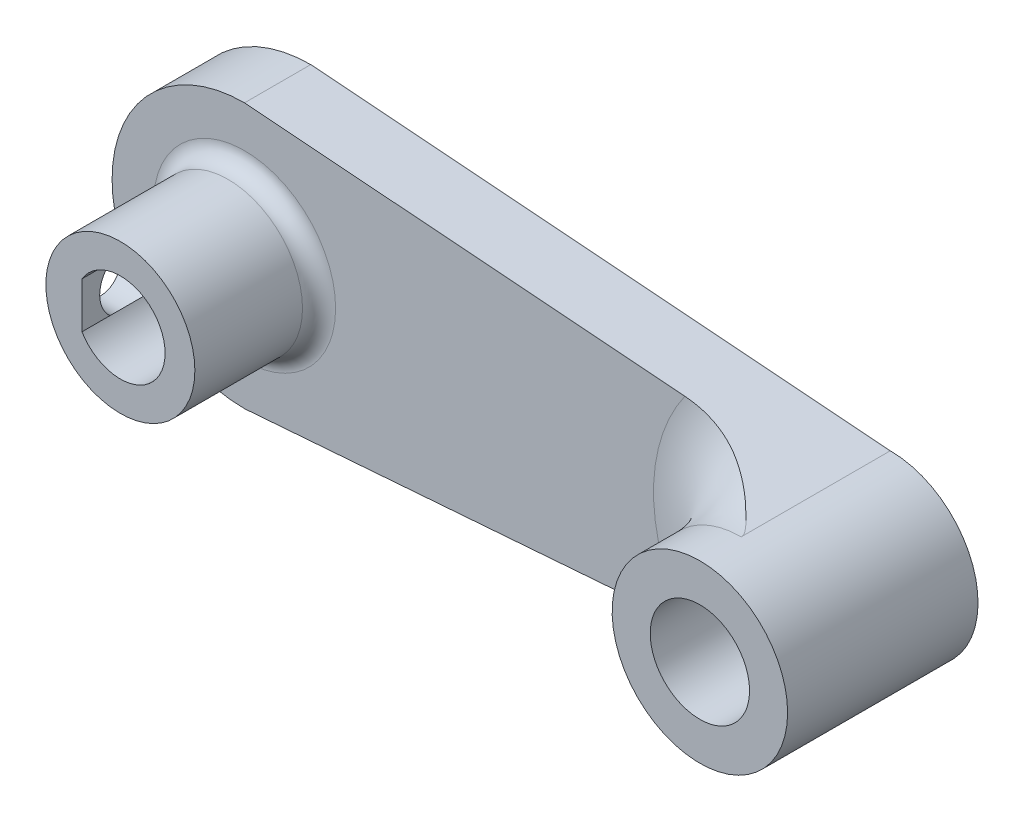
ISO-10303-21;
HEADER;
FILE_DESCRIPTION(('STEP AP214'),'2;1');
FILE_NAME('part.step','',(''),(''),'','','');
FILE_SCHEMA(('AUTOMOTIVE_DESIGN { 1 0 10303 214 1 1 1 1 }'));
ENDSEC;
DATA;
#1=APPLICATION_CONTEXT('core data for automotive mechanical design processes');
#2=APPLICATION_PROTOCOL_DEFINITION('international standard','automotive_design',2000,#1);
#3=PRODUCT_CONTEXT('',#1,'mechanical');
#4=PRODUCT('Part','Part','',(#3));
#5=PRODUCT_RELATED_PRODUCT_CATEGORY('part','',(#4));
#6=PRODUCT_DEFINITION_FORMATION('','',#4);
#7=PRODUCT_DEFINITION_CONTEXT('part definition',#1,'design');
#8=PRODUCT_DEFINITION('design','',#6,#7);
#9=PRODUCT_DEFINITION_SHAPE('','',#8);
#10=(LENGTH_UNIT() NAMED_UNIT(*) SI_UNIT(.MILLI.,.METRE.));
#11=(NAMED_UNIT(*) PLANE_ANGLE_UNIT() SI_UNIT($,.RADIAN.));
#12=(NAMED_UNIT(*) SI_UNIT($,.STERADIAN.) SOLID_ANGLE_UNIT());
#13=UNCERTAINTY_MEASURE_WITH_UNIT(LENGTH_MEASURE(1.E-05),#10,'distance_accuracy_value','');
#14=(GEOMETRIC_REPRESENTATION_CONTEXT(3) GLOBAL_UNCERTAINTY_ASSIGNED_CONTEXT((#13)) GLOBAL_UNIT_ASSIGNED_CONTEXT((#10,
#11,#12)) REPRESENTATION_CONTEXT('',''));
#15=CARTESIAN_POINT('',(0.,0.,0.));
#16=DIRECTION('',(0.,0.,1.));
#17=DIRECTION('',(1.,0.,0.));
#18=AXIS2_PLACEMENT_3D('',#15,#16,#17);
#19=CARTESIAN_POINT('',(-2.31770899812725,1.385,4.));
#20=DIRECTION('',(1.,0.,0.));
#21=DIRECTION('',(0.,0.,-1.));
#22=AXIS2_PLACEMENT_3D('',#19,#20,#21);
#23=PLANE('',#22);
#24=CARTESIAN_POINT('',(-2.31770899812725,0.,8.58156206194235));
#25=DIRECTION('',(1.,0.,0.));
#26=DIRECTION('',(0.,0.,-1.));
#27=AXIS2_PLACEMENT_3D('',#24,#25,#26);
#28=CIRCLE('',#27,1.85);
#29=CARTESIAN_POINT('',(-2.31770899812725,1.385,9.80805095304573));
#30=VERTEX_POINT('',#29);
#31=CARTESIAN_POINT('',(-2.31770899812725,-1.385,9.80805095304573));
#32=VERTEX_POINT('',#31);
#33=EDGE_CURVE('E138',#30,#32,#28,.T.);
#34=ORIENTED_EDGE('',*,*,#33,.F.);
#35=DIRECTION('',(0.,0.,-1.));
#36=VECTOR('',#35,1.);
#37=CARTESIAN_POINT('',(-2.31770899812725,1.385,4.));
#38=LINE('',#37,#36);
#39=CARTESIAN_POINT('',(-2.31770899812725,1.385,11.5));
#40=VERTEX_POINT('',#39);
#41=EDGE_CURVE('E150',#40,#30,#38,.T.);
#42=ORIENTED_EDGE('',*,*,#41,.F.);
#43=DIRECTION('',(0.,-1.,0.));
#44=VECTOR('',#43,1.);
#45=CARTESIAN_POINT('',(-2.31770899812725,1.385,11.5));
#46=LINE('',#45,#44);
#47=CARTESIAN_POINT('',(-2.31770899812725,-1.385,11.5));
#48=VERTEX_POINT('',#47);
#49=EDGE_CURVE('E312',#40,#48,#46,.T.);
#50=ORIENTED_EDGE('',*,*,#49,.T.);
#51=DIRECTION('',(0.,0.,-1.));
#52=VECTOR('',#51,1.);
#53=CARTESIAN_POINT('',(-2.31770899812725,-1.385,4.));
#54=LINE('',#53,#52);
#55=EDGE_CURVE('E148',#48,#32,#54,.T.);
#56=ORIENTED_EDGE('',*,*,#55,.T.);
#57=EDGE_LOOP('',(#34,#42,#50,#56));
#58=FACE_BOUND('',#57,.T.);
#59=ADVANCED_FACE('F41',(#58),#23,.T.);
#60=CARTESIAN_POINT('',(0.,0.,4.));
#61=DIRECTION('',(0.,0.,1.));
#62=DIRECTION('',(1.,0.,0.));
#63=AXIS2_PLACEMENT_3D('',#60,#61,#62);
#64=PLANE('',#63);
#65=CARTESIAN_POINT('',(0.,0.,4.));
#66=DIRECTION('',(0.,0.,1.));
#67=DIRECTION('',(1.,0.,0.));
#68=AXIS2_PLACEMENT_3D('',#65,#66,#67);
#69=CIRCLE('',#68,5.5);
#70=CARTESIAN_POINT('',(5.5,0.,4.));
#71=VERTEX_POINT('',#70);
#72=EDGE_CURVE('E206',#71,#71,#69,.F.);
#73=ORIENTED_EDGE('',*,*,#72,.T.);
#74=EDGE_LOOP('',(#73));
#75=FACE_BOUND('',#74,.T.);
#76=DIRECTION('',(0.997070106802791,0.0764931508062722,0.));
#77=VECTOR('',#76,1.);
#78=CARTESIAN_POINT('',(0.,-8.,4.));
#79=LINE('',#78,#77);
#80=CARTESIAN_POINT('',(0.,-8.,4.));
#81=VERTEX_POINT('',#80);
#82=CARTESIAN_POINT('',(26.5998702673474,-5.95931311759814,4.));
#83=VERTEX_POINT('',#82);
#84=EDGE_CURVE('E168',#81,#83,#79,.T.);
#85=ORIENTED_EDGE('',*,*,#84,.T.);
#86=CARTESIAN_POINT('',(35.,0.,4.));
#87=DIRECTION('',(0.,0.,1.));
#88=DIRECTION('',(1.,0.,0.));
#89=AXIS2_PLACEMENT_3D('',#86,#87,#88);
#90=CIRCLE('',#89,10.2993005762028);
#91=CARTESIAN_POINT('',(26.5919208086599,5.94809185126833,4.));
#92=VERTEX_POINT('',#91);
#93=EDGE_CURVE('E63',#83,#92,#90,.F.);
#94=ORIENTED_EDGE('',*,*,#93,.T.);
#95=DIRECTION('',(-0.997036176645934,0.0769341436506468,0.));
#96=VECTOR('',#95,1.);
#97=CARTESIAN_POINT('',(0.,8.,4.));
#98=LINE('',#97,#96);
#99=CARTESIAN_POINT('',(0.,8.,4.));
#100=VERTEX_POINT('',#99);
#101=EDGE_CURVE('E172',#92,#100,#98,.T.);
#102=ORIENTED_EDGE('',*,*,#101,.T.);
#103=CARTESIAN_POINT('',(0.,0.,4.));
#104=DIRECTION('',(0.,0.,1.));
#105=DIRECTION('',(1.,0.,0.));
#106=AXIS2_PLACEMENT_3D('',#103,#104,#105);
#107=CIRCLE('',#106,8.);
#108=EDGE_CURVE('E164',#100,#81,#107,.T.);
#109=ORIENTED_EDGE('',*,*,#108,.T.);
#110=EDGE_LOOP('',(#85,#94,#102,#109));
#111=FACE_BOUND('',#110,.T.);
#112=ADVANCED_FACE('F253',(#75,#111),#64,.T.);
#113=CARTESIAN_POINT('',(0.,0.,0.));
#114=DIRECTION('',(0.,0.,1.));
#115=DIRECTION('',(1.,0.,0.));
#116=AXIS2_PLACEMENT_3D('',#113,#114,#115);
#117=PLANE('',#116);
#118=CARTESIAN_POINT('',(35.,0.,0.));
#119=DIRECTION('',(0.,0.,1.));
#120=DIRECTION('',(1.,0.,0.));
#121=AXIS2_PLACEMENT_3D('',#118,#119,#120);
#122=CIRCLE('',#121,3.2);
#123=CARTESIAN_POINT('',(38.2,0.,0.));
#124=VERTEX_POINT('',#123);
#125=EDGE_CURVE('E156',#124,#124,#122,.T.);
#126=ORIENTED_EDGE('',*,*,#125,.T.);
#127=EDGE_LOOP('',(#126));
#128=FACE_BOUND('',#127,.T.);
#129=CARTESIAN_POINT('',(0.,0.,0.));
#130=DIRECTION('',(0.,0.,1.));
#131=DIRECTION('',(1.,0.,0.));
#132=AXIS2_PLACEMENT_3D('',#129,#130,#131);
#133=CIRCLE('',#132,8.);
#134=CARTESIAN_POINT('',(0.,8.,0.));
#135=VERTEX_POINT('',#134);
#136=CARTESIAN_POINT('',(0.,-8.,0.));
#137=VERTEX_POINT('',#136);
#138=EDGE_CURVE('E163',#135,#137,#133,.T.);
#139=ORIENTED_EDGE('',*,*,#138,.F.);
#140=DIRECTION('',(-0.997036176645934,0.0769341436506468,0.));
#141=VECTOR('',#140,1.);
#142=CARTESIAN_POINT('',(0.,8.,0.));
#143=LINE('',#142,#141);
#144=CARTESIAN_POINT('',(35.,5.2993005762028,0.));
#145=VERTEX_POINT('',#144);
#146=EDGE_CURVE('E169',#145,#135,#143,.T.);
#147=ORIENTED_EDGE('',*,*,#146,.F.);
#148=CARTESIAN_POINT('',(35.,0.,0.));
#149=DIRECTION('',(0.,0.,1.));
#150=DIRECTION('',(1.,0.,0.));
#151=AXIS2_PLACEMENT_3D('',#148,#149,#150);
#152=CIRCLE('',#151,5.2993005762028);
#153=CARTESIAN_POINT('',(35.4053601981432,-5.28377419149462,0.));
#154=VERTEX_POINT('',#153);
#155=EDGE_CURVE('E182',#154,#145,#152,.T.);
#156=ORIENTED_EDGE('',*,*,#155,.F.);
#157=DIRECTION('',(0.997070106802791,0.0764931508062722,0.));
#158=VECTOR('',#157,1.);
#159=CARTESIAN_POINT('',(0.,-8.,0.));
#160=LINE('',#159,#158);
#161=EDGE_CURVE('E179',#137,#154,#160,.T.);
#162=ORIENTED_EDGE('',*,*,#161,.F.);
#163=EDGE_LOOP('',(#139,#147,#156,#162));
#164=FACE_BOUND('',#163,.T.);
#165=CARTESIAN_POINT('',(0.,0.,0.));
#166=DIRECTION('',(0.,0.,1.));
#167=DIRECTION('',(1.,0.,0.));
#168=AXIS2_PLACEMENT_3D('',#165,#166,#167);
#169=CIRCLE('',#168,2.7);
#170=CARTESIAN_POINT('',(-2.31770899812725,-1.385,0.));
#171=VERTEX_POINT('',#170);
#172=CARTESIAN_POINT('',(-2.31770899812725,1.385,0.));
#173=VERTEX_POINT('',#172);
#174=EDGE_CURVE('E305',#171,#173,#169,.T.);
#175=ORIENTED_EDGE('',*,*,#174,.T.);
#176=DIRECTION('',(0.,-1.,0.));
#177=VECTOR('',#176,1.);
#178=CARTESIAN_POINT('',(-2.31770899812725,1.385,0.));
#179=LINE('',#178,#177);
#180=EDGE_CURVE('E143',#173,#171,#179,.T.);
#181=ORIENTED_EDGE('',*,*,#180,.T.);
#182=EDGE_LOOP('',(#175,#181));
#183=FACE_BOUND('',#182,.T.);
#184=ADVANCED_FACE('F258',(#128,#164,#183),#117,.F.);
#185=CARTESIAN_POINT('',(0.,0.,4.));
#186=DIRECTION('',(0.,0.,-1.));
#187=DIRECTION('',(-1.,0.,0.));
#188=AXIS2_PLACEMENT_3D('',#185,#186,#187);
#189=CYLINDRICAL_SURFACE('',#188,8.);
#190=ORIENTED_EDGE('',*,*,#138,.T.);
#191=DIRECTION('',(0.,0.,-1.));
#192=VECTOR('',#191,1.);
#193=CARTESIAN_POINT('',(0.,-8.,4.));
#194=LINE('',#193,#192);
#195=EDGE_CURVE('E198',#81,#137,#194,.T.);
#196=ORIENTED_EDGE('',*,*,#195,.F.);
#197=ORIENTED_EDGE('',*,*,#108,.F.);
#198=DIRECTION('',(0.,0.,-1.));
#199=VECTOR('',#198,1.);
#200=CARTESIAN_POINT('',(0.,8.,4.));
#201=LINE('',#200,#199);
#202=EDGE_CURVE('E175',#100,#135,#201,.T.);
#203=ORIENTED_EDGE('',*,*,#202,.T.);
#204=EDGE_LOOP('',(#190,#196,#197,#203));
#205=FACE_BOUND('',#204,.T.);
#206=ADVANCED_FACE('F270',(#205),#189,.T.);
#207=CARTESIAN_POINT('',(0.,-8.,4.));
#208=DIRECTION('',(-0.0764931508062722,0.997070106802791,0.));
#209=DIRECTION('',(-0.997070106802791,-0.0764931508062722,0.));
#210=AXIS2_PLACEMENT_3D('',#207,#208,#209);
#211=PLANE('',#210);
#212=ORIENTED_EDGE('',*,*,#161,.T.);
#213=DIRECTION('',(0.,0.,-1.));
#214=VECTOR('',#213,1.);
#215=CARTESIAN_POINT('',(35.4053601981432,-5.28377419149462,4.));
#216=LINE('',#215,#214);
#217=CARTESIAN_POINT('',(35.4053601981432,-5.28377419149462,9.));
#218=VERTEX_POINT('',#217);
#219=EDGE_CURVE('E194',#218,#154,#216,.T.);
#220=ORIENTED_EDGE('',*,*,#219,.F.);
#221=CARTESIAN_POINT('',(26.5998702673474,-5.95931311759814,4.));
#222=CARTESIAN_POINT('',(26.8132386211762,-5.9429439399893,3.99997392254403));
#223=CARTESIAN_POINT('',(27.0264846742696,-5.92658414503925,4.01009669839337));
#224=CARTESIAN_POINT('',(27.4509463745889,-5.89402032366653,4.04922944579764));
#225=CARTESIAN_POINT('',(27.6621645632361,-5.87781610227128,4.07821139459106));
#226=CARTESIAN_POINT('',(28.0789668038518,-5.84583989876233,4.15321756187651));
#227=CARTESIAN_POINT('',(28.2845878831228,-5.83006507599079,4.19903786066211));
#228=CARTESIAN_POINT('',(28.6917953620166,-5.79882496270292,4.30632586148612));
#229=CARTESIAN_POINT('',(28.8933797920704,-5.78335982328785,4.36780101042736));
#230=CARTESIAN_POINT('',(29.3744572623801,-5.74645255745486,4.53342856061496));
#231=CARTESIAN_POINT('',(29.6515230639646,-5.72519664375404,4.64470058661206));
#232=CARTESIAN_POINT('',(30.1946584009708,-5.68352842708766,4.89149070382841));
#233=CARTESIAN_POINT('',(30.4607241620949,-5.66311641367838,5.02701703349274));
#234=CARTESIAN_POINT('',(30.9827993475787,-5.62306388816092,5.31900980116569));
#235=CARTESIAN_POINT('',(31.2387529657888,-5.60342765738479,5.47557581134342));
#236=CARTESIAN_POINT('',(31.7398058723707,-5.56498791750733,5.80540470023674));
#237=CARTESIAN_POINT('',(31.9849001188991,-5.54618479520576,5.97867521845913));
#238=CARTESIAN_POINT('',(32.7925490747515,-5.48422364226673,6.58349516707241));
#239=CARTESIAN_POINT('',(33.3324613837962,-5.44280268962143,7.04517451614531));
#240=CARTESIAN_POINT('',(34.3798985112516,-5.36244548544504,8.00116907598813));
#241=CARTESIAN_POINT('',(34.8874528591123,-5.32350696847577,8.49545366836865));
#242=CARTESIAN_POINT('',(35.3984182836361,-5.28430676077902,8.99323715916587));
#243=CARTESIAN_POINT('',(35.401889239753,-5.28404047622403,8.99661857945717));
#244=CARTESIAN_POINT('',(35.4053601981432,-5.28377419149462,9.));
#245=B_SPLINE_CURVE_WITH_KNOTS('',3,(#221,#222,#223,#224,#225,#226,#227,#228,#229,#230,#231,
#232,#233,#234,#235,#236,#237,#238,#239,#240,#241,#242,#243,#244),.UNSPECIFIED.,.F.,.F.,(4,2,2,
2,2,2,2,2,2,2,2,4),(0.,0.641567182247231,1.28218323280429,1.91528391101597,2.54868631520907,
3.44524394732992,4.34210669265903,5.24337410978046,6.14505567850509,8.27576141205359,
10.4044940037782,10.4190532627927),.UNSPECIFIED.);
#246=EDGE_CURVE('E56',#218,#83,#245,.F.);
#247=ORIENTED_EDGE('',*,*,#246,.T.);
#248=ORIENTED_EDGE('',*,*,#84,.F.);
#249=ORIENTED_EDGE('',*,*,#195,.T.);
#250=EDGE_LOOP('',(#212,#220,#247,#248,#249));
#251=FACE_BOUND('',#250,.T.);
#252=ADVANCED_FACE('F279',(#251),#211,.F.);
#253=CARTESIAN_POINT('',(35.,0.,4.));
#254=DIRECTION('',(0.,0.,-1.));
#255=DIRECTION('',(-1.,0.,0.));
#256=AXIS2_PLACEMENT_3D('',#253,#254,#255);
#257=CYLINDRICAL_SURFACE('',#256,5.2993005762028);
#258=CARTESIAN_POINT('',(35.,0.,9.));
#259=DIRECTION('',(0.,0.,1.));
#260=DIRECTION('',(1.,0.,0.));
#261=AXIS2_PLACEMENT_3D('',#258,#259,#260);
#262=CIRCLE('',#261,5.2993005762028);
#263=CARTESIAN_POINT('',(35.,5.2993005762028,9.));
#264=VERTEX_POINT('',#263);
#265=EDGE_CURVE('E210',#264,#218,#262,.T.);
#266=ORIENTED_EDGE('',*,*,#265,.T.);
#267=ORIENTED_EDGE('',*,*,#219,.T.);
#268=ORIENTED_EDGE('',*,*,#155,.T.);
#269=DIRECTION('',(0.,0.,-1.));
#270=VECTOR('',#269,1.);
#271=CARTESIAN_POINT('',(35.,5.2993005762028,4.));
#272=LINE('',#271,#270);
#273=EDGE_CURVE('E190',#264,#145,#272,.T.);
#274=ORIENTED_EDGE('',*,*,#273,.F.);
#275=EDGE_LOOP('',(#266,#267,#268,#274));
#276=FACE_BOUND('',#275,.T.);
#277=CARTESIAN_POINT('',(35.,0.,11.5));
#278=DIRECTION('',(0.,0.,1.));
#279=DIRECTION('',(1.,0.,0.));
#280=AXIS2_PLACEMENT_3D('',#277,#278,#279);
#281=CIRCLE('',#280,5.2993005762028);
#282=CARTESIAN_POINT('',(40.2993005762028,0.,11.5));
#283=VERTEX_POINT('',#282);
#284=EDGE_CURVE('E325',#283,#283,#281,.T.);
#285=ORIENTED_EDGE('',*,*,#284,.F.);
#286=EDGE_LOOP('',(#285));
#287=FACE_BOUND('',#286,.T.);
#288=ADVANCED_FACE('F275',(#276,#287),#257,.T.);
#289=CARTESIAN_POINT('',(0.,8.,4.));
#290=DIRECTION('',(-0.0769341436506468,-0.997036176645934,0.));
#291=DIRECTION('',(0.997036176645934,-0.0769341436506468,0.));
#292=AXIS2_PLACEMENT_3D('',#289,#290,#291);
#293=PLANE('',#292);
#294=ORIENTED_EDGE('',*,*,#146,.T.);
#295=ORIENTED_EDGE('',*,*,#202,.F.);
#296=ORIENTED_EDGE('',*,*,#101,.F.);
#297=CARTESIAN_POINT('',(26.5919208086599,5.94809185126833,4.));
#298=CARTESIAN_POINT('',(26.8051605842276,5.93163766443957,3.99997389542849));
#299=CARTESIAN_POINT('',(27.0182785301913,5.91519287832915,4.01010673630318));
#300=CARTESIAN_POINT('',(27.4424816669492,5.88246015927157,4.0492874131764));
#301=CARTESIAN_POINT('',(27.6535693822087,5.86617203152951,4.07830746477213));
#302=CARTESIAN_POINT('',(28.0703811226492,5.83400965360839,4.15347518646677));
#303=CARTESIAN_POINT('',(28.2761380883871,5.81813286164237,4.19944178272287));
#304=CARTESIAN_POINT('',(28.6835823197541,5.78669330733145,4.30710423472807));
#305=CARTESIAN_POINT('',(28.8852676388674,5.77113069518523,4.36880743003734));
#306=CARTESIAN_POINT('',(29.3639854033241,5.7341914725958,4.53420622386028));
#307=CARTESIAN_POINT('',(29.6386554992673,5.712997147743,4.64480611106799));
#308=CARTESIAN_POINT('',(30.1770854976113,5.6714503595635,4.89003145259013));
#309=CARTESIAN_POINT('',(30.4408414459516,5.65109820134333,5.02466552192758));
#310=CARTESIAN_POINT('',(30.958037111555,5.61118991459803,5.31462430523333));
#311=CARTESIAN_POINT('',(31.2114333181569,5.59163714347911,5.47002649731549));
#312=CARTESIAN_POINT('',(31.7071533141849,5.55338598040375,5.79745658625287));
#313=CARTESIAN_POINT('',(31.9494792251469,5.53468742474358,5.96948127768369));
#314=CARTESIAN_POINT('',(32.4055202504863,5.49949800376181,6.31300470289831));
#315=CARTESIAN_POINT('',(32.6199932812932,5.48294865545551,6.48349954008582));
#316=CARTESIAN_POINT('',(33.0409910265507,5.4504632735116,6.83345244130637));
#317=CARTESIAN_POINT('',(33.2475268113917,5.43452638565121,7.0128971550213));
#318=CARTESIAN_POINT('',(33.5805818475522,5.40882691295832,7.31350048063011));
#319=CARTESIAN_POINT('',(33.7091477193419,5.39890640507653,7.43239401042852));
#320=CARTESIAN_POINT('',(33.9633465610935,5.37929170034943,7.67319741749072));
#321=CARTESIAN_POINT('',(34.0889808070951,5.36959740504127,7.7951059329703));
#322=CARTESIAN_POINT('',(34.2853989278592,5.3544412248821,7.99174637845935));
#323=CARTESIAN_POINT('',(34.3574434082321,5.34888206812122,8.0652085923432));
#324=CARTESIAN_POINT('',(34.4996468355534,5.33790924771469,8.21421459419294));
#325=CARTESIAN_POINT('',(34.5698020665728,5.33249587080068,8.28976196575932));
#326=CARTESIAN_POINT('',(34.690450386053,5.32318630374632,8.42657669618301));
#327=CARTESIAN_POINT('',(34.7417421132749,5.3192284883705,8.48711183823271));
#328=CARTESIAN_POINT('',(34.8146157810322,5.31360534915559,8.581081955263));
#329=CARTESIAN_POINT('',(34.8382214100703,5.31178387176296,8.61292041436684));
#330=CARTESIAN_POINT('',(34.8831100224831,5.30832013891502,8.67818363758521));
#331=CARTESIAN_POINT('',(34.9043967512895,5.30667759445153,8.7116057146904));
#332=CARTESIAN_POINT('',(34.9380569226609,5.30408028001074,8.77225313555896));
#333=CARTESIAN_POINT('',(34.9513322237828,5.3030559200653,8.79896336673625));
#334=CARTESIAN_POINT('',(34.9739636957225,5.30130961140166,8.85388544195868));
#335=CARTESIAN_POINT('',(34.9833485459243,5.30058544970073,8.88208450476221));
#336=CARTESIAN_POINT('',(34.9931202715783,5.29983143559092,8.92548061642464));
#337=CARTESIAN_POINT('',(34.9956612695484,5.29963536496939,8.94018687011352));
#338=CARTESIAN_POINT('',(34.9991191773591,5.29936854297991,8.96992039151783));
#339=CARTESIAN_POINT('',(35.0000213913867,5.29929892558264,8.9849493527923));
#340=CARTESIAN_POINT('',(35.,5.2993005762028,9.));
#341=B_SPLINE_CURVE_WITH_KNOTS('',3,(#297,#298,#299,#300,#301,#302,#303,#304,#305,#306,#307,
#308,#309,#310,#311,#312,#313,#314,#315,#316,#317,#318,#319,#320,#321,#322,#323,#324,#325,#326,
#327,#328,#329,#330,#331,#332,#333,#334,#335,#336,#337,#338,#339,#340),.UNSPECIFIED.,.F.,.F.,(4,
2,2,2,2,2,2,2,2,2,2,2,2,2,2,2,2,2,2,2,2,4),(0.,0.641202171131687,1.28146321474307,
1.91507248375818,2.54897781071211,3.4381413483161,4.32762424782039,5.22052327293435,
6.11325045685485,6.93640184446374,7.7583600826152,8.28450560013555,8.81041766279523,
9.11952342755051,9.42919832543136,9.66734408172639,9.78632575414892,9.90511230814192,
9.99448205851119,10.0831807515254,10.1278708354375,10.1729597360964),.UNSPECIFIED.);
#342=EDGE_CURVE('E11',#92,#264,#341,.T.);
#343=ORIENTED_EDGE('',*,*,#342,.T.);
#344=ORIENTED_EDGE('',*,*,#273,.T.);
#345=EDGE_LOOP('',(#294,#295,#296,#343,#344));
#346=FACE_BOUND('',#345,.T.);
#347=ADVANCED_FACE('F266',(#346),#293,.F.);
#348=CARTESIAN_POINT('',(35.,0.,4.));
#349=DIRECTION('',(0.,0.,-1.));
#350=DIRECTION('',(-1.,0.,0.));
#351=AXIS2_PLACEMENT_3D('',#348,#349,#350);
#352=CYLINDRICAL_SURFACE('',#351,3.2);
#353=CARTESIAN_POINT('',(35.,0.,4.));
#354=DIRECTION('',(0.,0.,1.));
#355=DIRECTION('',(1.,0.,0.));
#356=AXIS2_PLACEMENT_3D('',#353,#354,#355);
#357=CIRCLE('',#356,3.2);
#358=CARTESIAN_POINT('',(38.2,0.,4.));
#359=VERTEX_POINT('',#358);
#360=EDGE_CURVE('E321',#359,#359,#357,.T.);
#361=ORIENTED_EDGE('',*,*,#360,.T.);
#362=EDGE_LOOP('',(#361));
#363=FACE_BOUND('',#362,.T.);
#364=ORIENTED_EDGE('',*,*,#125,.F.);
#365=EDGE_LOOP('',(#364));
#366=FACE_BOUND('',#365,.T.);
#367=ADVANCED_FACE('F264',(#363,#366),#352,.F.);
#368=CARTESIAN_POINT('',(0.,0.,4.));
#369=DIRECTION('',(0.,0.,-1.));
#370=DIRECTION('',(-1.,0.,0.));
#371=AXIS2_PLACEMENT_3D('',#368,#369,#370);
#372=CYLINDRICAL_SURFACE('',#371,2.7);
#373=ORIENTED_EDGE('',*,*,#174,.F.);
#374=CARTESIAN_POINT('',(-2.31770899812725,-1.385,7.35507317083897));
#375=VERTEX_POINT('',#374);
#376=EDGE_CURVE('E311',#375,#171,#54,.T.);
#377=ORIENTED_EDGE('',*,*,#376,.F.);
#378=EDGE_CURVE('E341',#32,#375,#54,.T.);
#379=ORIENTED_EDGE('',*,*,#378,.F.);
#380=ORIENTED_EDGE('',*,*,#55,.F.);
#381=CARTESIAN_POINT('',(0.,0.,11.5));
#382=DIRECTION('',(0.,0.,1.));
#383=DIRECTION('',(-1.,0.,0.));
#384=AXIS2_PLACEMENT_3D('',#381,#382,#383);
#385=CIRCLE('',#384,2.7);
#386=EDGE_CURVE('E318',#48,#40,#385,.T.);
#387=ORIENTED_EDGE('',*,*,#386,.T.);
#388=ORIENTED_EDGE('',*,*,#41,.T.);
#389=CARTESIAN_POINT('',(-2.31770899812725,1.385,7.35507317083897));
#390=VERTEX_POINT('',#389);
#391=EDGE_CURVE('E135',#30,#390,#38,.T.);
#392=ORIENTED_EDGE('',*,*,#391,.T.);
#393=EDGE_CURVE('E140',#390,#173,#38,.T.);
#394=ORIENTED_EDGE('',*,*,#393,.T.);
#395=EDGE_LOOP('',(#373,#377,#379,#380,#387,#388,#392,#394));
#396=FACE_BOUND('',#395,.T.);
#397=ADVANCED_FACE('F152',(#396),#372,.F.);
#398=EDGE_CURVE('E118',#375,#390,#28,.T.);
#399=ORIENTED_EDGE('',*,*,#398,.F.);
#400=ORIENTED_EDGE('',*,*,#376,.T.);
#401=ORIENTED_EDGE('',*,*,#180,.F.);
#402=ORIENTED_EDGE('',*,*,#393,.F.);
#403=EDGE_LOOP('',(#399,#400,#401,#402));
#404=FACE_BOUND('',#403,.T.);
#405=ADVANCED_FACE('F141',(#404),#23,.T.);
#406=CARTESIAN_POINT('',(0.,0.,11.5));
#407=DIRECTION('',(0.,0.,1.));
#408=DIRECTION('',(1.,0.,0.));
#409=AXIS2_PLACEMENT_3D('',#406,#407,#408);
#410=PLANE('',#409);
#411=CARTESIAN_POINT('',(0.,0.,11.5));
#412=DIRECTION('',(0.,0.,1.));
#413=DIRECTION('',(1.,0.,0.));
#414=AXIS2_PLACEMENT_3D('',#411,#412,#413);
#415=CIRCLE('',#414,4.5);
#416=CARTESIAN_POINT('',(4.5,0.,11.5));
#417=VERTEX_POINT('',#416);
#418=EDGE_CURVE('E307',#417,#417,#415,.T.);
#419=ORIENTED_EDGE('',*,*,#418,.T.);
#420=EDGE_LOOP('',(#419));
#421=FACE_BOUND('',#420,.T.);
#422=ORIENTED_EDGE('',*,*,#49,.F.);
#423=ORIENTED_EDGE('',*,*,#386,.F.);
#424=EDGE_LOOP('',(#422,#423));
#425=FACE_BOUND('',#424,.T.);
#426=ADVANCED_FACE('F242',(#421,#425),#410,.T.);
#427=CARTESIAN_POINT('',(0.,0.,11.5));
#428=DIRECTION('',(0.,0.,-1.));
#429=DIRECTION('',(-1.,0.,0.));
#430=AXIS2_PLACEMENT_3D('',#427,#428,#429);
#431=CYLINDRICAL_SURFACE('',#430,4.5);
#432=CARTESIAN_POINT('',(-4.5,0.,10.4315620619424));
#433=CARTESIAN_POINT('',(-4.49999236049547,-0.0992099846473282,10.431551846103));
#434=CARTESIAN_POINT('',(-4.49668093327062,-0.198581616826438,10.4235341043957));
#435=CARTESIAN_POINT('',(-4.48375548698992,-0.39451363999919,10.3917453058325));
#436=CARTESIAN_POINT('',(-4.47412478528336,-0.491065881222446,10.367932548905));
#437=CARTESIAN_POINT('',(-4.44959666323133,-0.678205527544849,10.305576812623));
#438=CARTESIAN_POINT('',(-4.43471689882294,-0.768811735841189,10.2670831796056));
#439=CARTESIAN_POINT('',(-4.40114509742087,-0.942194627657636,10.1766593644735));
#440=CARTESIAN_POINT('',(-4.38245427209446,-1.02497378745198,10.1247334515361));
#441=CARTESIAN_POINT('',(-4.34210958142232,-1.18455078339075,10.0062215559351));
#442=CARTESIAN_POINT('',(-4.3203603642406,-1.26091325562118,9.93908207976621));
#443=CARTESIAN_POINT('',(-4.27677097947424,-1.40166682202359,9.7932184368471));
#444=CARTESIAN_POINT('',(-4.25493077102076,-1.46605176619203,9.71448835572385));
#445=CARTESIAN_POINT('',(-4.21247158980418,-1.58404764830715,9.5431324672559));
#446=CARTESIAN_POINT('',(-4.19196023865163,-1.6369998313775,9.45002359494144));
#447=CARTESIAN_POINT('',(-4.15598778045605,-1.72629674442563,9.25525362026606));
#448=CARTESIAN_POINT('',(-4.14052414112787,-1.76264980534552,9.15359683842437));
#449=CARTESIAN_POINT('',(-4.11742715727602,-1.81593111361932,8.94962564404326));
#450=CARTESIAN_POINT('',(-4.10945841536966,-1.83369587103351,8.84756916217449));
#451=CARTESIAN_POINT('',(-4.10128632974971,-1.85190729794881,8.64163669087306));
#452=CARTESIAN_POINT('',(-4.10107886397237,-1.85236316031745,8.53776169659462));
#453=CARTESIAN_POINT('',(-4.10816815103326,-1.83657521293137,8.33937168862181));
#454=CARTESIAN_POINT('',(-4.11490884286835,-1.8215688774497,8.24473437913139));
#455=CARTESIAN_POINT('',(-4.13419740300247,-1.77735404016667,8.0594637674831));
#456=CARTESIAN_POINT('',(-4.14674634924682,-1.74814290206612,7.96883121198336));
#457=CARTESIAN_POINT('',(-4.17651849053049,-1.67578213381393,7.7918873026308));
#458=CARTESIAN_POINT('',(-4.19383431738772,-1.63235265697075,7.70570667605852));
#459=CARTESIAN_POINT('',(-4.23116628501091,-1.53298537325918,7.54152727345664));
#460=CARTESIAN_POINT('',(-4.2511834731106,-1.47704270939573,7.46353169177058));
#461=CARTESIAN_POINT('',(-4.29366199536257,-1.34884526213662,7.31120003082037));
#462=CARTESIAN_POINT('',(-4.31618909934486,-1.27562857991851,7.23768954219136));
#463=CARTESIAN_POINT('',(-4.35975961238261,-1.11767749110131,7.10371771937427));
#464=CARTESIAN_POINT('',(-4.38080269122451,-1.03294053330527,7.04325928329588));
#465=CARTESIAN_POINT('',(-4.41961617678893,-0.851901957295007,6.93594058412035));
#466=CARTESIAN_POINT('',(-4.43730469482149,-0.755387480342297,6.88940760046915));
#467=CARTESIAN_POINT('',(-4.46679079367851,-0.554987870880777,6.81352628947532));
#468=CARTESIAN_POINT('',(-4.47859154089803,-0.45110673450878,6.78416872386375));
#469=CARTESIAN_POINT('',(-4.49438583707553,-0.245829096704424,6.74517986881034));
#470=CARTESIAN_POINT('',(-4.49881739761436,-0.144676766033121,6.7344401063005));
#471=CARTESIAN_POINT('',(-4.50076591507613,0.0580730502496339,6.72969769694391));
#472=CARTESIAN_POINT('',(-4.49828479095705,0.159670404505202,6.73569040517222));
#473=CARTESIAN_POINT('',(-4.48697177202371,0.355291890944609,6.7634418220086));
#474=CARTESIAN_POINT('',(-4.47845062287308,0.449445393816876,6.78442947882141));
#475=CARTESIAN_POINT('',(-4.45624301708188,0.632797445209041,6.8405100203684));
#476=CARTESIAN_POINT('',(-4.44255590383832,0.721995362211387,6.87560469816628));
#477=CARTESIAN_POINT('',(-4.41080778328087,0.896015470051197,6.96005044650571));
#478=CARTESIAN_POINT('',(-4.39262456399527,0.980616927107149,7.00980896678325));
#479=CARTESIAN_POINT('',(-4.35383551109427,1.14057051488669,7.12172088301977));
#480=CARTESIAN_POINT('',(-4.33322867991585,1.21591881072508,7.18387939021547));
#481=CARTESIAN_POINT('',(-4.2900455822829,1.36073933130225,7.3238957070961));
#482=CARTESIAN_POINT('',(-4.26743210606218,1.4294368522152,7.40254539667444));
#483=CARTESIAN_POINT('',(-4.22408542652514,1.55286594976441,7.5706312397597));
#484=CARTESIAN_POINT('',(-4.20335260954645,1.60759466100353,7.66006960079571));
#485=CARTESIAN_POINT('',(-4.16601640868377,1.70203718479411,7.84886631975386));
#486=CARTESIAN_POINT('',(-4.14946855531543,1.74155238749134,7.94833581312334));
#487=CARTESIAN_POINT('',(-4.12316872602981,1.80294650188405,8.15340824004015));
#488=CARTESIAN_POINT('',(-4.11341134727119,1.82483943691475,8.25900622480444));
#489=CARTESIAN_POINT('',(-4.10260751406838,1.84899174856933,8.46476682437599));
#490=CARTESIAN_POINT('',(-4.10096026313642,1.85260582383811,8.56473969903013));
#491=CARTESIAN_POINT('',(-4.10497439053343,1.84369455080225,8.76380371522511));
#492=CARTESIAN_POINT('',(-4.11063471622209,1.83117152701168,8.86289498168954));
#493=CARTESIAN_POINT('',(-4.12808343237869,1.79146916380664,9.05288621080006));
#494=CARTESIAN_POINT('',(-4.13959040580574,1.7649609059975,9.14395468286381));
#495=CARTESIAN_POINT('',(-4.16722266946965,1.69868695877268,9.32037790706559));
#496=CARTESIAN_POINT('',(-4.18334925001667,1.65891756485717,9.40573105461769));
#497=CARTESIAN_POINT('',(-4.21958819815847,1.56453551372486,9.57381293449863));
#498=CARTESIAN_POINT('',(-4.23988001929758,1.50918345020272,9.65608709084518));
#499=CARTESIAN_POINT('',(-4.28164680559803,1.38625789267435,9.8106037097558));
#500=CARTESIAN_POINT('',(-4.30312216164676,1.31868034391859,9.88284282996766));
#501=CARTESIAN_POINT('',(-4.34664507515044,1.16759273059439,10.0204443364174));
#502=CARTESIAN_POINT('',(-4.36862721065428,1.083297865062,10.0849696578427));
#503=CARTESIAN_POINT('',(-4.40916489977816,0.904254815000999,10.1989931894907));
#504=CARTESIAN_POINT('',(-4.4277188822875,0.809501869188949,10.2484845163445));
#505=CARTESIAN_POINT('',(-4.45902477593764,0.61380062914342,10.3299306936255));
#506=CARTESIAN_POINT('',(-4.47187155136231,0.512987949193933,10.3621742400106));
#507=CARTESIAN_POINT('',(-4.49070363335878,0.306918456874384,10.4089623334052));
#508=CARTESIAN_POINT('',(-4.49671051972127,0.201676713998354,10.4235625539356));
#509=CARTESIAN_POINT('',(-4.49966020128979,0.0640777420227655,10.4307331154295));
#510=CARTESIAN_POINT('',(-4.5000024677509,0.0320473045790341,10.4315653619138));
#511=CARTESIAN_POINT('',(-4.5,0.,10.4315620619424));
#512=B_SPLINE_CURVE_WITH_KNOTS('',3,(#432,#433,#434,#435,#436,#437,#438,#439,#440,#441,#442,
#443,#444,#445,#446,#447,#448,#449,#450,#451,#452,#453,#454,#455,#456,#457,#458,#459,#460,#461,
#462,#463,#464,#465,#466,#467,#468,#469,#470,#471,#472,#473,#474,#475,#476,#477,#478,#479,#480,
#481,#482,#483,#484,#485,#486,#487,#488,#489,#490,#491,#492,#493,#494,#495,#496,#497,#498,#499,
#500,#501,#502,#503,#504,#505,#506,#507,#508,#509,#510,#511),.UNSPECIFIED.,.T.,.F.,(4,2,2,2,2,2,
2,2,2,2,2,2,2,2,2,2,2,2,2,2,2,2,2,2,2,2,2,2,2,2,2,2,2,2,2,2,2,2,2,4),(0.,0.297540582947049,
0.595869839547188,0.893205045806391,1.19044586597339,1.50103100121824,1.8117751725492,
2.1373113427365,2.46268394933211,2.77268579124664,3.08252298684805,3.3693540848375,
3.6562384367421,3.94914782202729,4.24217109802752,4.55924132054266,4.8763818738596,
5.20047723256776,5.52439810705999,5.8282702256239,6.13205799783743,6.42125509742057,
6.7104889668417,7.00867059543497,7.30697538849607,7.62605550077852,7.9452010128906,
8.26838203353541,8.59130562029762,8.88990462789539,9.18846062776245,9.47384304955477,
9.75930525983863,10.0616685942123,10.3641323959898,10.687799301619,11.0116141767244,
11.3298244519869,11.6470279704368,11.7431410151089),.UNSPECIFIED.);
#513=CARTESIAN_POINT('',(-4.5,0.,10.4315620619424));
#514=VERTEX_POINT('',#513);
#515=EDGE_CURVE('E137',#514,#514,#512,.T.);
#516=ORIENTED_EDGE('',*,*,#515,.T.);
#517=EDGE_LOOP('',(#516));
#518=FACE_BOUND('',#517,.T.);
#519=CARTESIAN_POINT('',(0.,0.,5.));
#520=DIRECTION('',(0.,0.,1.));
#521=DIRECTION('',(1.,0.,0.));
#522=AXIS2_PLACEMENT_3D('',#519,#520,#521);
#523=CIRCLE('',#522,4.5);
#524=CARTESIAN_POINT('',(4.5,0.,5.));
#525=VERTEX_POINT('',#524);
#526=EDGE_CURVE('E202',#525,#525,#523,.T.);
#527=ORIENTED_EDGE('',*,*,#526,.T.);
#528=EDGE_LOOP('',(#527));
#529=FACE_BOUND('',#528,.T.);
#530=ORIENTED_EDGE('',*,*,#418,.F.);
#531=EDGE_LOOP('',(#530));
#532=FACE_BOUND('',#531,.T.);
#533=ADVANCED_FACE('F221',(#518,#529,#532),#431,.T.);
#534=CARTESIAN_POINT('',(0.,0.,5.));
#535=DIRECTION('',(0.,0.,1.));
#536=DIRECTION('',(1.,0.,0.));
#537=AXIS2_PLACEMENT_3D('',#534,#535,#536);
#538=TOROIDAL_SURFACE('',#537,5.5,1.);
#539=ORIENTED_EDGE('',*,*,#72,.F.);
#540=EDGE_LOOP('',(#539));
#541=FACE_BOUND('',#540,.T.);
#542=ORIENTED_EDGE('',*,*,#526,.F.);
#543=EDGE_LOOP('',(#542));
#544=FACE_BOUND('',#543,.T.);
#545=ADVANCED_FACE('F240',(#541,#544),#538,.F.);
#546=CARTESIAN_POINT('',(35.,0.,4.));
#547=DIRECTION('',(0.,0.,1.));
#548=DIRECTION('',(1.,0.,0.));
#549=AXIS2_PLACEMENT_3D('',#546,#547,#548);
#550=PLANE('',#549);
#551=CARTESIAN_POINT('',(35.,0.,4.));
#552=DIRECTION('',(0.,0.,1.));
#553=DIRECTION('',(1.,0.,0.));
#554=AXIS2_PLACEMENT_3D('',#551,#552,#553);
#555=CIRCLE('',#554,3.);
#556=CARTESIAN_POINT('',(38.,0.,4.));
#557=VERTEX_POINT('',#556);
#558=EDGE_CURVE('E329',#557,#557,#555,.T.);
#559=ORIENTED_EDGE('',*,*,#558,.T.);
#560=EDGE_LOOP('',(#559));
#561=FACE_BOUND('',#560,.T.);
#562=ORIENTED_EDGE('',*,*,#360,.F.);
#563=EDGE_LOOP('',(#562));
#564=FACE_BOUND('',#563,.T.);
#565=ADVANCED_FACE('F237',(#561,#564),#550,.F.);
#566=CARTESIAN_POINT('',(35.,0.,26.4886854919151));
#567=DIRECTION('',(0.,0.,-1.));
#568=DIRECTION('',(-1.,0.,0.));
#569=AXIS2_PLACEMENT_3D('',#566,#567,#568);
#570=CYLINDRICAL_SURFACE('',#569,3.);
#571=ORIENTED_EDGE('',*,*,#558,.F.);
#572=EDGE_LOOP('',(#571));
#573=FACE_BOUND('',#572,.T.);
#574=CARTESIAN_POINT('',(35.,0.,11.5));
#575=DIRECTION('',(0.,0.,1.));
#576=DIRECTION('',(1.,0.,0.));
#577=AXIS2_PLACEMENT_3D('',#574,#575,#576);
#578=CIRCLE('',#577,3.);
#579=CARTESIAN_POINT('',(38.,0.,11.5));
#580=VERTEX_POINT('',#579);
#581=EDGE_CURVE('E219',#580,#580,#578,.T.);
#582=ORIENTED_EDGE('',*,*,#581,.T.);
#583=EDGE_LOOP('',(#582));
#584=FACE_BOUND('',#583,.T.);
#585=ADVANCED_FACE('F233',(#573,#584),#570,.F.);
#586=CARTESIAN_POINT('',(0.,0.,11.5));
#587=DIRECTION('',(0.,0.,1.));
#588=DIRECTION('',(1.,0.,0.));
#589=AXIS2_PLACEMENT_3D('',#586,#587,#588);
#590=PLANE('',#589);
#591=ORIENTED_EDGE('',*,*,#581,.F.);
#592=EDGE_LOOP('',(#591));
#593=FACE_BOUND('',#592,.T.);
#594=ORIENTED_EDGE('',*,*,#284,.T.);
#595=EDGE_LOOP('',(#594));
#596=FACE_BOUND('',#595,.T.);
#597=ADVANCED_FACE('F230',(#593,#596),#590,.T.);
#598=CARTESIAN_POINT('',(-2.31770899812725,0.,8.58156206194235));
#599=DIRECTION('',(1.,0.,0.));
#600=DIRECTION('',(0.,0.,-1.));
#601=AXIS2_PLACEMENT_3D('',#598,#599,#600);
#602=PLANE('',#601);
#603=ORIENTED_EDGE('',*,*,#378,.T.);
#604=EDGE_CURVE('E125',#32,#375,#28,.T.);
#605=ORIENTED_EDGE('',*,*,#604,.F.);
#606=EDGE_LOOP('',(#603,#605));
#607=FACE_BOUND('',#606,.T.);
#608=ADVANCED_FACE('F229',(#607),#602,.F.);
#609=CARTESIAN_POINT('',(-8.31770899812725,0.,8.58156206194235));
#610=DIRECTION('',(1.,0.,0.));
#611=DIRECTION('',(0.,0.,-1.));
#612=AXIS2_PLACEMENT_3D('',#609,#610,#611);
#613=CYLINDRICAL_SURFACE('',#612,1.85);
#614=EDGE_CURVE('E123',#390,#30,#28,.T.);
#615=ORIENTED_EDGE('',*,*,#614,.T.);
#616=ORIENTED_EDGE('',*,*,#33,.T.);
#617=ORIENTED_EDGE('',*,*,#604,.T.);
#618=ORIENTED_EDGE('',*,*,#398,.T.);
#619=EDGE_LOOP('',(#615,#616,#617,#618));
#620=FACE_BOUND('',#619,.T.);
#621=ORIENTED_EDGE('',*,*,#515,.F.);
#622=EDGE_LOOP('',(#621));
#623=FACE_BOUND('',#622,.T.);
#624=ADVANCED_FACE('F120',(#620,#623),#613,.F.);
#625=ORIENTED_EDGE('',*,*,#391,.F.);
#626=ORIENTED_EDGE('',*,*,#614,.F.);
#627=EDGE_LOOP('',(#625,#626));
#628=FACE_BOUND('',#627,.T.);
#629=ADVANCED_FACE('F133',(#628),#602,.F.);
#630=CARTESIAN_POINT('',(35.,0.,9.));
#631=DIRECTION('',(0.,0.,1.));
#632=DIRECTION('',(1.,0.,0.));
#633=AXIS2_PLACEMENT_3D('',#630,#631,#632);
#634=TOROIDAL_SURFACE('',#633,10.2993005762028,5.);
#635=ORIENTED_EDGE('',*,*,#342,.F.);
#636=ORIENTED_EDGE('',*,*,#93,.F.);
#637=ORIENTED_EDGE('',*,*,#246,.F.);
#638=ORIENTED_EDGE('',*,*,#265,.F.);
#639=EDGE_LOOP('',(#635,#636,#637,#638));
#640=FACE_BOUND('',#639,.T.);
#641=ADVANCED_FACE('F43',(#640),#634,.F.);
#642=CLOSED_SHELL('',(#59,#112,#184,#206,#252,#288,#347,#367,#397,#405,#426,#533,#545,#565,#585,
#597,#608,#624,#629,#641));
#643=MANIFOLD_SOLID_BREP('B2',#642);
#644=ADVANCED_BREP_SHAPE_REPRESENTATION('',(#18,#643),#14);
#645=SHAPE_DEFINITION_REPRESENTATION(#9,#644);
ENDSEC;
END-ISO-10303-21;
